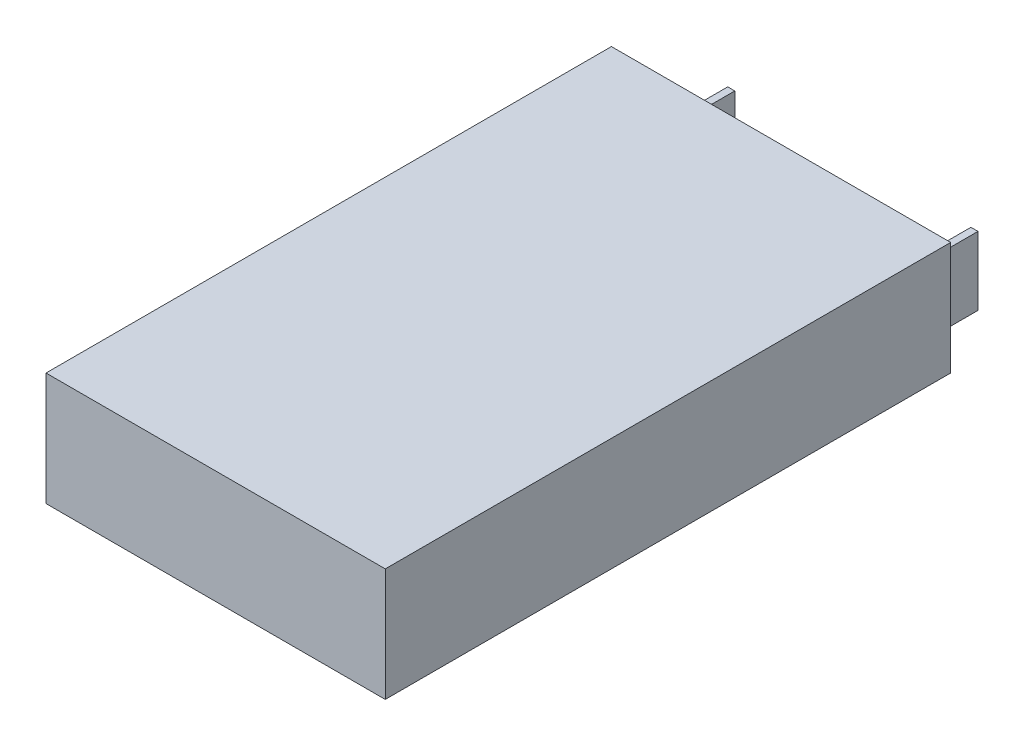
ISO-10303-21;
HEADER;
FILE_DESCRIPTION(('STEP AP214'),'2;1');
FILE_NAME('part.step','',(''),(''),'','','');
FILE_SCHEMA(('AUTOMOTIVE_DESIGN { 1 0 10303 214 1 1 1 1 }'));
ENDSEC;
DATA;
#1=APPLICATION_CONTEXT('core data for automotive mechanical design processes');
#2=APPLICATION_PROTOCOL_DEFINITION('international standard','automotive_design',2000,#1);
#3=PRODUCT_CONTEXT('',#1,'mechanical');
#4=PRODUCT('Part','Part','',(#3));
#5=PRODUCT_RELATED_PRODUCT_CATEGORY('part','',(#4));
#6=PRODUCT_DEFINITION_FORMATION('','',#4);
#7=PRODUCT_DEFINITION_CONTEXT('part definition',#1,'design');
#8=PRODUCT_DEFINITION('design','',#6,#7);
#9=PRODUCT_DEFINITION_SHAPE('','',#8);
#10=(LENGTH_UNIT() NAMED_UNIT(*) SI_UNIT(.MILLI.,.METRE.));
#11=(NAMED_UNIT(*) PLANE_ANGLE_UNIT() SI_UNIT($,.RADIAN.));
#12=(NAMED_UNIT(*) SI_UNIT($,.STERADIAN.) SOLID_ANGLE_UNIT());
#13=UNCERTAINTY_MEASURE_WITH_UNIT(LENGTH_MEASURE(1.E-05),#10,'distance_accuracy_value','');
#14=(GEOMETRIC_REPRESENTATION_CONTEXT(3) GLOBAL_UNCERTAINTY_ASSIGNED_CONTEXT((#13)) GLOBAL_UNIT_ASSIGNED_CONTEXT((#10,
#11,#12)) REPRESENTATION_CONTEXT('',''));
#15=CARTESIAN_POINT('',(0.,0.,0.));
#16=DIRECTION('',(0.,0.,1.));
#17=DIRECTION('',(1.,0.,0.));
#18=AXIS2_PLACEMENT_3D('',#15,#16,#17);
#19=CARTESIAN_POINT('',(0.,25.4,-63.5));
#20=DIRECTION('',(0.,0.,1.));
#21=DIRECTION('',(1.,0.,0.));
#22=AXIS2_PLACEMENT_3D('',#19,#20,#21);
#23=PLANE('',#22);
#24=DIRECTION('',(0.,-1.,0.));
#25=VECTOR('',#24,1.);
#26=CARTESIAN_POINT('',(-25.6330537401242,0.,-63.5));
#27=LINE('',#26,#25);
#28=CARTESIAN_POINT('',(-25.6330537401242,15.37716,-63.5));
#29=VERTEX_POINT('',#28);
#30=CARTESIAN_POINT('',(-25.6330537401242,0.,-63.5));
#31=VERTEX_POINT('',#30);
#32=EDGE_CURVE('E55',#29,#31,#27,.T.);
#33=ORIENTED_EDGE('',*,*,#32,.F.);
#34=DIRECTION('',(1.,0.,0.));
#35=VECTOR('',#34,1.);
#36=CARTESIAN_POINT('',(0.,15.37716,-63.5));
#37=LINE('',#36,#35);
#38=CARTESIAN_POINT('',(-27.2205537401242,15.37716,-63.5));
#39=VERTEX_POINT('',#38);
#40=EDGE_CURVE('E60',#39,#29,#37,.T.);
#41=ORIENTED_EDGE('',*,*,#40,.F.);
#42=DIRECTION('',(0.,1.,0.));
#43=VECTOR('',#42,1.);
#44=CARTESIAN_POINT('',(-27.2205537401242,0.,-63.5));
#45=LINE('',#44,#43);
#46=CARTESIAN_POINT('',(-27.2205537401242,0.,-63.5));
#47=VERTEX_POINT('',#46);
#48=EDGE_CURVE('E147',#47,#39,#45,.T.);
#49=ORIENTED_EDGE('',*,*,#48,.F.);
#50=DIRECTION('',(-1.,0.,0.));
#51=VECTOR('',#50,1.);
#52=CARTESIAN_POINT('',(0.,0.,-63.5));
#53=LINE('',#52,#51);
#54=CARTESIAN_POINT('',(-38.1,0.,-63.5));
#55=VERTEX_POINT('',#54);
#56=EDGE_CURVE('E184',#47,#55,#53,.T.);
#57=ORIENTED_EDGE('',*,*,#56,.T.);
#58=DIRECTION('',(0.,-1.,0.));
#59=VECTOR('',#58,1.);
#60=CARTESIAN_POINT('',(-38.1,25.4,-63.5));
#61=LINE('',#60,#59);
#62=CARTESIAN_POINT('',(-38.1,25.4,-63.5));
#63=VERTEX_POINT('',#62);
#64=EDGE_CURVE('E11',#63,#55,#61,.T.);
#65=ORIENTED_EDGE('',*,*,#64,.F.);
#66=DIRECTION('',(-1.,0.,0.));
#67=VECTOR('',#66,1.);
#68=CARTESIAN_POINT('',(0.,25.4,-63.5));
#69=LINE('',#68,#67);
#70=CARTESIAN_POINT('',(38.1,25.4,-63.5));
#71=VERTEX_POINT('',#70);
#72=EDGE_CURVE('E185',#71,#63,#69,.T.);
#73=ORIENTED_EDGE('',*,*,#72,.F.);
#74=DIRECTION('',(0.,-1.,0.));
#75=VECTOR('',#74,1.);
#76=CARTESIAN_POINT('',(38.1,25.4,-63.5));
#77=LINE('',#76,#75);
#78=CARTESIAN_POINT('',(38.1,0.,-63.5));
#79=VERTEX_POINT('',#78);
#80=EDGE_CURVE('E197',#71,#79,#77,.T.);
#81=ORIENTED_EDGE('',*,*,#80,.T.);
#82=CARTESIAN_POINT('',(28.9941,0.,-63.5));
#83=VERTEX_POINT('',#82);
#84=EDGE_CURVE('E198',#79,#83,#53,.T.);
#85=ORIENTED_EDGE('',*,*,#84,.T.);
#86=DIRECTION('',(0.,1.,0.));
#87=VECTOR('',#86,1.);
#88=CARTESIAN_POINT('',(28.9941,0.,-63.5));
#89=LINE('',#88,#87);
#90=CARTESIAN_POINT('',(28.9941,15.37716,-63.5));
#91=VERTEX_POINT('',#90);
#92=EDGE_CURVE('E163',#83,#91,#89,.T.);
#93=ORIENTED_EDGE('',*,*,#92,.T.);
#94=DIRECTION('',(-1.,0.,0.));
#95=VECTOR('',#94,1.);
#96=CARTESIAN_POINT('',(0.,15.37716,-63.5));
#97=LINE('',#96,#95);
#98=CARTESIAN_POINT('',(27.4066,15.37716,-63.5));
#99=VERTEX_POINT('',#98);
#100=EDGE_CURVE('E153',#91,#99,#97,.T.);
#101=ORIENTED_EDGE('',*,*,#100,.T.);
#102=DIRECTION('',(0.,-1.,0.));
#103=VECTOR('',#102,1.);
#104=CARTESIAN_POINT('',(27.4066,0.,-63.5));
#105=LINE('',#104,#103);
#106=CARTESIAN_POINT('',(27.4066,0.,-63.5));
#107=VERTEX_POINT('',#106);
#108=EDGE_CURVE('E150',#99,#107,#105,.T.);
#109=ORIENTED_EDGE('',*,*,#108,.T.);
#110=EDGE_CURVE('E202',#107,#31,#53,.T.);
#111=ORIENTED_EDGE('',*,*,#110,.T.);
#112=EDGE_LOOP('',(#33,#41,#49,#57,#65,#73,#81,#85,#93,#101,#109,#111));
#113=FACE_BOUND('',#112,.T.);
#114=ADVANCED_FACE('F41',(#113),#23,.F.);
#115=CARTESIAN_POINT('',(-38.1,25.4,0.));
#116=DIRECTION('',(1.,0.,0.));
#117=DIRECTION('',(0.,0.,-1.));
#118=AXIS2_PLACEMENT_3D('',#115,#116,#117);
#119=PLANE('',#118);
#120=DIRECTION('',(0.,0.,1.));
#121=VECTOR('',#120,1.);
#122=CARTESIAN_POINT('',(-38.1,0.,0.));
#123=LINE('',#122,#121);
#124=CARTESIAN_POINT('',(-38.1,0.,63.5));
#125=VERTEX_POINT('',#124);
#126=EDGE_CURVE('E201',#55,#125,#123,.T.);
#127=ORIENTED_EDGE('',*,*,#126,.T.);
#128=DIRECTION('',(0.,-1.,0.));
#129=VECTOR('',#128,1.);
#130=CARTESIAN_POINT('',(-38.1,25.4,63.5));
#131=LINE('',#130,#129);
#132=CARTESIAN_POINT('',(-38.1,25.4,63.5));
#133=VERTEX_POINT('',#132);
#134=EDGE_CURVE('E48',#133,#125,#131,.T.);
#135=ORIENTED_EDGE('',*,*,#134,.F.);
#136=DIRECTION('',(0.,0.,1.));
#137=VECTOR('',#136,1.);
#138=CARTESIAN_POINT('',(-38.1,25.4,0.));
#139=LINE('',#138,#137);
#140=EDGE_CURVE('E188',#63,#133,#139,.T.);
#141=ORIENTED_EDGE('',*,*,#140,.F.);
#142=ORIENTED_EDGE('',*,*,#64,.T.);
#143=EDGE_LOOP('',(#127,#135,#141,#142));
#144=FACE_BOUND('',#143,.T.);
#145=ADVANCED_FACE('F219',(#144),#119,.F.);
#146=CARTESIAN_POINT('',(0.,25.4,63.5));
#147=DIRECTION('',(0.,0.,1.));
#148=DIRECTION('',(1.,0.,0.));
#149=AXIS2_PLACEMENT_3D('',#146,#147,#148);
#150=PLANE('',#149);
#151=DIRECTION('',(-1.,0.,0.));
#152=VECTOR('',#151,1.);
#153=CARTESIAN_POINT('',(0.,0.,63.5));
#154=LINE('',#153,#152);
#155=CARTESIAN_POINT('',(38.1,0.,63.5));
#156=VERTEX_POINT('',#155);
#157=EDGE_CURVE('E205',#156,#125,#154,.T.);
#158=ORIENTED_EDGE('',*,*,#157,.F.);
#159=DIRECTION('',(0.,-1.,0.));
#160=VECTOR('',#159,1.);
#161=CARTESIAN_POINT('',(38.1,25.4,63.5));
#162=LINE('',#161,#160);
#163=CARTESIAN_POINT('',(38.1,25.4,63.5));
#164=VERTEX_POINT('',#163);
#165=EDGE_CURVE('E211',#164,#156,#162,.T.);
#166=ORIENTED_EDGE('',*,*,#165,.F.);
#167=DIRECTION('',(-1.,0.,0.));
#168=VECTOR('',#167,1.);
#169=CARTESIAN_POINT('',(0.,25.4,63.5));
#170=LINE('',#169,#168);
#171=EDGE_CURVE('E191',#164,#133,#170,.T.);
#172=ORIENTED_EDGE('',*,*,#171,.T.);
#173=ORIENTED_EDGE('',*,*,#134,.T.);
#174=EDGE_LOOP('',(#158,#166,#172,#173));
#175=FACE_BOUND('',#174,.T.);
#176=ADVANCED_FACE('F215',(#175),#150,.T.);
#177=CARTESIAN_POINT('',(38.1,25.4,0.));
#178=DIRECTION('',(1.,0.,0.));
#179=DIRECTION('',(0.,0.,-1.));
#180=AXIS2_PLACEMENT_3D('',#177,#178,#179);
#181=PLANE('',#180);
#182=DIRECTION('',(0.,0.,1.));
#183=VECTOR('',#182,1.);
#184=CARTESIAN_POINT('',(38.1,0.,0.));
#185=LINE('',#184,#183);
#186=EDGE_CURVE('E189',#79,#156,#185,.T.);
#187=ORIENTED_EDGE('',*,*,#186,.F.);
#188=ORIENTED_EDGE('',*,*,#80,.F.);
#189=DIRECTION('',(0.,0.,1.));
#190=VECTOR('',#189,1.);
#191=CARTESIAN_POINT('',(38.1,25.4,0.));
#192=LINE('',#191,#190);
#193=EDGE_CURVE('E194',#71,#164,#192,.T.);
#194=ORIENTED_EDGE('',*,*,#193,.T.);
#195=ORIENTED_EDGE('',*,*,#165,.T.);
#196=EDGE_LOOP('',(#187,#188,#194,#195));
#197=FACE_BOUND('',#196,.T.);
#198=ADVANCED_FACE('F226',(#197),#181,.T.);
#199=CARTESIAN_POINT('',(0.,25.4,0.));
#200=DIRECTION('',(0.,1.,0.));
#201=DIRECTION('',(0.,0.,1.));
#202=AXIS2_PLACEMENT_3D('',#199,#200,#201);
#203=PLANE('',#202);
#204=ORIENTED_EDGE('',*,*,#72,.T.);
#205=ORIENTED_EDGE('',*,*,#140,.T.);
#206=ORIENTED_EDGE('',*,*,#171,.F.);
#207=ORIENTED_EDGE('',*,*,#193,.F.);
#208=EDGE_LOOP('',(#204,#205,#206,#207));
#209=FACE_BOUND('',#208,.T.);
#210=ADVANCED_FACE('F230',(#209),#203,.T.);
#211=CARTESIAN_POINT('',(0.,0.,0.));
#212=DIRECTION('',(0.,1.,0.));
#213=DIRECTION('',(0.,0.,1.));
#214=AXIS2_PLACEMENT_3D('',#211,#212,#213);
#215=PLANE('',#214);
#216=ORIENTED_EDGE('',*,*,#84,.F.);
#217=ORIENTED_EDGE('',*,*,#186,.T.);
#218=ORIENTED_EDGE('',*,*,#157,.T.);
#219=ORIENTED_EDGE('',*,*,#126,.F.);
#220=ORIENTED_EDGE('',*,*,#56,.F.);
#221=DIRECTION('',(0.,0.,1.));
#222=VECTOR('',#221,1.);
#223=CARTESIAN_POINT('',(-27.2205537401242,0.,-78.74));
#224=LINE('',#223,#222);
#225=CARTESIAN_POINT('',(-27.2205537401242,0.,-78.74));
#226=VERTEX_POINT('',#225);
#227=EDGE_CURVE('E155',#226,#47,#224,.T.);
#228=ORIENTED_EDGE('',*,*,#227,.F.);
#229=DIRECTION('',(-1.,0.,0.));
#230=VECTOR('',#229,1.);
#231=CARTESIAN_POINT('',(0.,0.,-78.74));
#232=LINE('',#231,#230);
#233=CARTESIAN_POINT('',(-25.6330537401242,0.,-78.74));
#234=VERTEX_POINT('',#233);
#235=EDGE_CURVE('E137',#234,#226,#232,.T.);
#236=ORIENTED_EDGE('',*,*,#235,.F.);
#237=DIRECTION('',(0.,0.,1.));
#238=VECTOR('',#237,1.);
#239=CARTESIAN_POINT('',(-25.6330537401242,0.,-78.74));
#240=LINE('',#239,#238);
#241=EDGE_CURVE('E134',#234,#31,#240,.T.);
#242=ORIENTED_EDGE('',*,*,#241,.T.);
#243=ORIENTED_EDGE('',*,*,#110,.F.);
#244=DIRECTION('',(0.,0.,1.));
#245=VECTOR('',#244,1.);
#246=CARTESIAN_POINT('',(27.4066,0.,-78.74));
#247=LINE('',#246,#245);
#248=CARTESIAN_POINT('',(27.4066,0.,-78.74));
#249=VERTEX_POINT('',#248);
#250=EDGE_CURVE('E170',#249,#107,#247,.T.);
#251=ORIENTED_EDGE('',*,*,#250,.F.);
#252=DIRECTION('',(-1.,0.,0.));
#253=VECTOR('',#252,1.);
#254=CARTESIAN_POINT('',(0.,0.,-78.74));
#255=LINE('',#254,#253);
#256=CARTESIAN_POINT('',(28.9941,0.,-78.74));
#257=VERTEX_POINT('',#256);
#258=EDGE_CURVE('E169',#257,#249,#255,.T.);
#259=ORIENTED_EDGE('',*,*,#258,.F.);
#260=DIRECTION('',(0.,0.,1.));
#261=VECTOR('',#260,1.);
#262=CARTESIAN_POINT('',(28.9941,0.,-78.74));
#263=LINE('',#262,#261);
#264=EDGE_CURVE('E177',#257,#83,#263,.T.);
#265=ORIENTED_EDGE('',*,*,#264,.T.);
#266=EDGE_LOOP('',(#216,#217,#218,#219,#220,#228,#236,#242,#243,#251,#259,#265));
#267=FACE_BOUND('',#266,.T.);
#268=ADVANCED_FACE('F223',(#267),#215,.F.);
#269=CARTESIAN_POINT('',(27.4066,0.,-78.74));
#270=DIRECTION('',(-1.,0.,0.));
#271=DIRECTION('',(0.,0.,1.));
#272=AXIS2_PLACEMENT_3D('',#269,#270,#271);
#273=PLANE('',#272);
#274=ORIENTED_EDGE('',*,*,#108,.F.);
#275=DIRECTION('',(0.,0.,1.));
#276=VECTOR('',#275,1.);
#277=CARTESIAN_POINT('',(27.4066,15.37716,-78.74));
#278=LINE('',#277,#276);
#279=CARTESIAN_POINT('',(27.4066,15.37716,-78.74));
#280=VERTEX_POINT('',#279);
#281=EDGE_CURVE('E181',#280,#99,#278,.T.);
#282=ORIENTED_EDGE('',*,*,#281,.F.);
#283=DIRECTION('',(0.,-1.,0.));
#284=VECTOR('',#283,1.);
#285=CARTESIAN_POINT('',(27.4066,0.,-78.74));
#286=LINE('',#285,#284);
#287=EDGE_CURVE('E159',#280,#249,#286,.T.);
#288=ORIENTED_EDGE('',*,*,#287,.T.);
#289=ORIENTED_EDGE('',*,*,#250,.T.);
#290=EDGE_LOOP('',(#274,#282,#288,#289));
#291=FACE_BOUND('',#290,.T.);
#292=ADVANCED_FACE('F265',(#291),#273,.T.);
#293=CARTESIAN_POINT('',(0.,15.37716,-78.74));
#294=DIRECTION('',(0.,1.,0.));
#295=DIRECTION('',(0.,0.,1.));
#296=AXIS2_PLACEMENT_3D('',#293,#294,#295);
#297=PLANE('',#296);
#298=ORIENTED_EDGE('',*,*,#100,.F.);
#299=DIRECTION('',(0.,0.,1.));
#300=VECTOR('',#299,1.);
#301=CARTESIAN_POINT('',(28.9941,15.37716,-78.74));
#302=LINE('',#301,#300);
#303=CARTESIAN_POINT('',(28.9941,15.37716,-78.74));
#304=VERTEX_POINT('',#303);
#305=EDGE_CURVE('E179',#304,#91,#302,.T.);
#306=ORIENTED_EDGE('',*,*,#305,.F.);
#307=DIRECTION('',(-1.,0.,0.));
#308=VECTOR('',#307,1.);
#309=CARTESIAN_POINT('',(0.,15.37716,-78.74));
#310=LINE('',#309,#308);
#311=EDGE_CURVE('E162',#304,#280,#310,.T.);
#312=ORIENTED_EDGE('',*,*,#311,.T.);
#313=ORIENTED_EDGE('',*,*,#281,.T.);
#314=EDGE_LOOP('',(#298,#306,#312,#313));
#315=FACE_BOUND('',#314,.T.);
#316=ADVANCED_FACE('F270',(#315),#297,.T.);
#317=CARTESIAN_POINT('',(28.9941,0.,-78.74));
#318=DIRECTION('',(1.,0.,0.));
#319=DIRECTION('',(0.,0.,-1.));
#320=AXIS2_PLACEMENT_3D('',#317,#318,#319);
#321=PLANE('',#320);
#322=ORIENTED_EDGE('',*,*,#92,.F.);
#323=ORIENTED_EDGE('',*,*,#264,.F.);
#324=DIRECTION('',(0.,1.,0.));
#325=VECTOR('',#324,1.);
#326=CARTESIAN_POINT('',(28.9941,0.,-78.74));
#327=LINE('',#326,#325);
#328=EDGE_CURVE('E166',#257,#304,#327,.T.);
#329=ORIENTED_EDGE('',*,*,#328,.T.);
#330=ORIENTED_EDGE('',*,*,#305,.T.);
#331=EDGE_LOOP('',(#322,#323,#329,#330));
#332=FACE_BOUND('',#331,.T.);
#333=ADVANCED_FACE('F274',(#332),#321,.T.);
#334=CARTESIAN_POINT('',(0.,0.,-78.74));
#335=DIRECTION('',(0.,0.,-1.));
#336=DIRECTION('',(-1.,0.,0.));
#337=AXIS2_PLACEMENT_3D('',#334,#335,#336);
#338=PLANE('',#337);
#339=ORIENTED_EDGE('',*,*,#287,.F.);
#340=ORIENTED_EDGE('',*,*,#311,.F.);
#341=ORIENTED_EDGE('',*,*,#328,.F.);
#342=ORIENTED_EDGE('',*,*,#258,.T.);
#343=EDGE_LOOP('',(#339,#340,#341,#342));
#344=FACE_BOUND('',#343,.T.);
#345=ADVANCED_FACE('F278',(#344),#338,.T.);
#346=CARTESIAN_POINT('',(0.,15.37716,-78.74));
#347=DIRECTION('',(0.,-1.,0.));
#348=DIRECTION('',(0.,0.,-1.));
#349=AXIS2_PLACEMENT_3D('',#346,#347,#348);
#350=PLANE('',#349);
#351=ORIENTED_EDGE('',*,*,#40,.T.);
#352=DIRECTION('',(0.,0.,1.));
#353=VECTOR('',#352,1.);
#354=CARTESIAN_POINT('',(-25.6330537401242,15.37716,-78.74));
#355=LINE('',#354,#353);
#356=CARTESIAN_POINT('',(-25.6330537401242,15.37716,-78.74));
#357=VERTEX_POINT('',#356);
#358=EDGE_CURVE('E132',#357,#29,#355,.T.);
#359=ORIENTED_EDGE('',*,*,#358,.F.);
#360=DIRECTION('',(1.,0.,0.));
#361=VECTOR('',#360,1.);
#362=CARTESIAN_POINT('',(0.,15.37716,-78.74));
#363=LINE('',#362,#361);
#364=CARTESIAN_POINT('',(-27.2205537401242,15.37716,-78.74));
#365=VERTEX_POINT('',#364);
#366=EDGE_CURVE('E138',#365,#357,#363,.T.);
#367=ORIENTED_EDGE('',*,*,#366,.F.);
#368=DIRECTION('',(0.,0.,1.));
#369=VECTOR('',#368,1.);
#370=CARTESIAN_POINT('',(-27.2205537401242,15.37716,-78.74));
#371=LINE('',#370,#369);
#372=EDGE_CURVE('E237',#365,#39,#371,.T.);
#373=ORIENTED_EDGE('',*,*,#372,.T.);
#374=EDGE_LOOP('',(#351,#359,#367,#373));
#375=FACE_BOUND('',#374,.T.);
#376=ADVANCED_FACE('F149',(#375),#350,.F.);
#377=CARTESIAN_POINT('',(-25.6330537401242,0.,-78.74));
#378=DIRECTION('',(-1.,0.,0.));
#379=DIRECTION('',(0.,0.,1.));
#380=AXIS2_PLACEMENT_3D('',#377,#378,#379);
#381=PLANE('',#380);
#382=ORIENTED_EDGE('',*,*,#32,.T.);
#383=ORIENTED_EDGE('',*,*,#241,.F.);
#384=DIRECTION('',(0.,-1.,0.));
#385=VECTOR('',#384,1.);
#386=CARTESIAN_POINT('',(-25.6330537401242,0.,-78.74));
#387=LINE('',#386,#385);
#388=EDGE_CURVE('E128',#357,#234,#387,.T.);
#389=ORIENTED_EDGE('',*,*,#388,.F.);
#390=ORIENTED_EDGE('',*,*,#358,.T.);
#391=EDGE_LOOP('',(#382,#383,#389,#390));
#392=FACE_BOUND('',#391,.T.);
#393=ADVANCED_FACE('F130',(#392),#381,.F.);
#394=CARTESIAN_POINT('',(-27.2205537401242,0.,-78.74));
#395=DIRECTION('',(1.,0.,0.));
#396=DIRECTION('',(0.,0.,-1.));
#397=AXIS2_PLACEMENT_3D('',#394,#395,#396);
#398=PLANE('',#397);
#399=ORIENTED_EDGE('',*,*,#48,.T.);
#400=ORIENTED_EDGE('',*,*,#372,.F.);
#401=DIRECTION('',(0.,1.,0.));
#402=VECTOR('',#401,1.);
#403=CARTESIAN_POINT('',(-27.2205537401242,0.,-78.74));
#404=LINE('',#403,#402);
#405=EDGE_CURVE('E143',#226,#365,#404,.T.);
#406=ORIENTED_EDGE('',*,*,#405,.F.);
#407=ORIENTED_EDGE('',*,*,#227,.T.);
#408=EDGE_LOOP('',(#399,#400,#406,#407));
#409=FACE_BOUND('',#408,.T.);
#410=ADVANCED_FACE('F243',(#409),#398,.F.);
#411=CARTESIAN_POINT('',(0.,0.,-78.74));
#412=DIRECTION('',(0.,0.,-1.));
#413=DIRECTION('',(-1.,0.,0.));
#414=AXIS2_PLACEMENT_3D('',#411,#412,#413);
#415=PLANE('',#414);
#416=ORIENTED_EDGE('',*,*,#366,.T.);
#417=ORIENTED_EDGE('',*,*,#388,.T.);
#418=ORIENTED_EDGE('',*,*,#235,.T.);
#419=ORIENTED_EDGE('',*,*,#405,.T.);
#420=EDGE_LOOP('',(#416,#417,#418,#419));
#421=FACE_BOUND('',#420,.T.);
#422=ADVANCED_FACE('F141',(#421),#415,.T.);
#423=CLOSED_SHELL('',(#114,#145,#176,#198,#210,#268,#292,#316,#333,#345,#376,#393,#410,#422));
#424=MANIFOLD_SOLID_BREP('B2',#423);
#425=ADVANCED_BREP_SHAPE_REPRESENTATION('',(#18,#424),#14);
#426=SHAPE_DEFINITION_REPRESENTATION(#9,#425);
ENDSEC;
END-ISO-10303-21;
